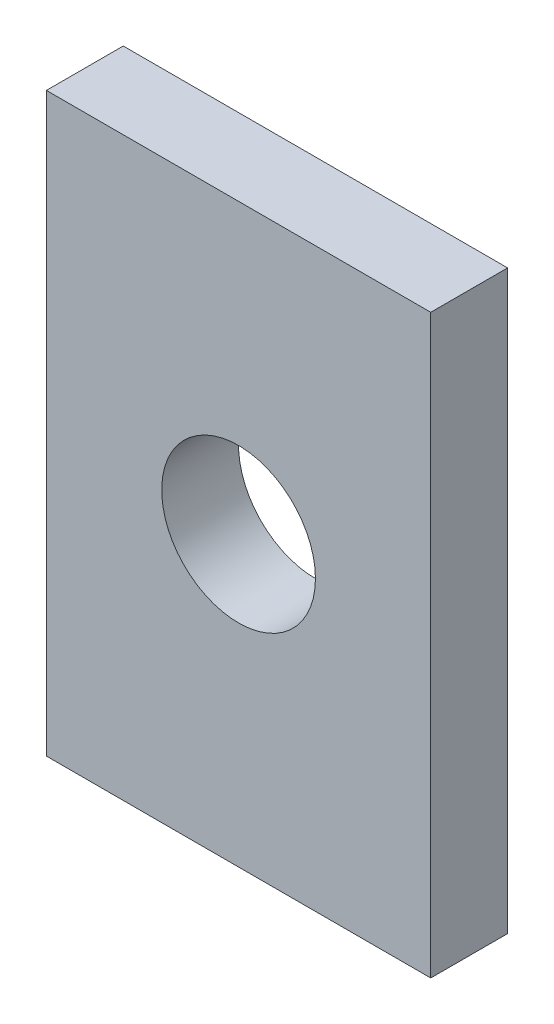
ISO-10303-21;
HEADER;
FILE_DESCRIPTION(('STEP AP214'),'2;1');
FILE_NAME('part.step','',(''),(''),'','','');
FILE_SCHEMA(('AUTOMOTIVE_DESIGN { 1 0 10303 214 1 1 1 1 }'));
ENDSEC;
DATA;
#1=APPLICATION_CONTEXT('core data for automotive mechanical design processes');
#2=APPLICATION_PROTOCOL_DEFINITION('international standard','automotive_design',2000,#1);
#3=PRODUCT_CONTEXT('',#1,'mechanical');
#4=PRODUCT('Part','Part','',(#3));
#5=PRODUCT_RELATED_PRODUCT_CATEGORY('part','',(#4));
#6=PRODUCT_DEFINITION_FORMATION('','',#4);
#7=PRODUCT_DEFINITION_CONTEXT('part definition',#1,'design');
#8=PRODUCT_DEFINITION('design','',#6,#7);
#9=PRODUCT_DEFINITION_SHAPE('','',#8);
#10=(LENGTH_UNIT() NAMED_UNIT(*) SI_UNIT(.MILLI.,.METRE.));
#11=(NAMED_UNIT(*) PLANE_ANGLE_UNIT() SI_UNIT($,.RADIAN.));
#12=(NAMED_UNIT(*) SI_UNIT($,.STERADIAN.) SOLID_ANGLE_UNIT());
#13=UNCERTAINTY_MEASURE_WITH_UNIT(LENGTH_MEASURE(1.E-05),#10,'distance_accuracy_value','');
#14=(GEOMETRIC_REPRESENTATION_CONTEXT(3) GLOBAL_UNCERTAINTY_ASSIGNED_CONTEXT((#13)) GLOBAL_UNIT_ASSIGNED_CONTEXT((#10,
#11,#12)) REPRESENTATION_CONTEXT('',''));
#15=CARTESIAN_POINT('',(0.,0.,0.));
#16=DIRECTION('',(0.,0.,1.));
#17=DIRECTION('',(1.,0.,0.));
#18=AXIS2_PLACEMENT_3D('',#15,#16,#17);
#19=CARTESIAN_POINT('',(0.,0.,8.));
#20=DIRECTION('',(0.,0.,-1.));
#21=DIRECTION('',(-1.,0.,0.));
#22=AXIS2_PLACEMENT_3D('',#19,#20,#21);
#23=PLANE('',#22);
#24=DIRECTION('',(0.,1.,0.));
#25=VECTOR('',#24,1.);
#26=CARTESIAN_POINT('',(20.,-30.,8.));
#27=LINE('',#26,#25);
#28=CARTESIAN_POINT('',(20.,-30.,8.));
#29=VERTEX_POINT('',#28);
#30=CARTESIAN_POINT('',(20.,30.,8.));
#31=VERTEX_POINT('',#30);
#32=EDGE_CURVE('E85',#29,#31,#27,.T.);
#33=ORIENTED_EDGE('',*,*,#32,.T.);
#34=DIRECTION('',(-1.,0.,0.));
#35=VECTOR('',#34,1.);
#36=CARTESIAN_POINT('',(-20.,30.,8.));
#37=LINE('',#36,#35);
#38=CARTESIAN_POINT('',(-20.,30.,8.));
#39=VERTEX_POINT('',#38);
#40=EDGE_CURVE('E80',#31,#39,#37,.T.);
#41=ORIENTED_EDGE('',*,*,#40,.T.);
#42=DIRECTION('',(0.,-1.,0.));
#43=VECTOR('',#42,1.);
#44=CARTESIAN_POINT('',(-20.,-30.,8.));
#45=LINE('',#44,#43);
#46=CARTESIAN_POINT('',(-20.,-30.,8.));
#47=VERTEX_POINT('',#46);
#48=EDGE_CURVE('E83',#39,#47,#45,.T.);
#49=ORIENTED_EDGE('',*,*,#48,.T.);
#50=DIRECTION('',(1.,0.,0.));
#51=VECTOR('',#50,1.);
#52=CARTESIAN_POINT('',(-20.,-30.,8.));
#53=LINE('',#52,#51);
#54=EDGE_CURVE('E50',#47,#29,#53,.T.);
#55=ORIENTED_EDGE('',*,*,#54,.T.);
#56=EDGE_LOOP('',(#33,#41,#49,#55));
#57=FACE_BOUND('',#56,.T.);
#58=CARTESIAN_POINT('',(0.,0.,8.));
#59=DIRECTION('',(0.,0.,1.));
#60=DIRECTION('',(1.,0.,0.));
#61=AXIS2_PLACEMENT_3D('',#58,#59,#60);
#62=CIRCLE('',#61,8.);
#63=CARTESIAN_POINT('',(8.00000000000001,0.,8.));
#64=VERTEX_POINT('',#63);
#65=EDGE_CURVE('E100',#64,#64,#62,.T.);
#66=ORIENTED_EDGE('',*,*,#65,.F.);
#67=EDGE_LOOP('',(#66));
#68=FACE_BOUND('',#67,.T.);
#69=ADVANCED_FACE('F33',(#57,#68),#23,.F.);
#70=CARTESIAN_POINT('',(0.,0.,0.));
#71=DIRECTION('',(0.,0.,-1.));
#72=DIRECTION('',(-1.,0.,0.));
#73=AXIS2_PLACEMENT_3D('',#70,#71,#72);
#74=PLANE('',#73);
#75=DIRECTION('',(0.,1.,0.));
#76=VECTOR('',#75,1.);
#77=CARTESIAN_POINT('',(20.,-30.,0.));
#78=LINE('',#77,#76);
#79=CARTESIAN_POINT('',(20.,-30.,0.));
#80=VERTEX_POINT('',#79);
#81=CARTESIAN_POINT('',(20.,30.,0.));
#82=VERTEX_POINT('',#81);
#83=EDGE_CURVE('E97',#80,#82,#78,.T.);
#84=ORIENTED_EDGE('',*,*,#83,.F.);
#85=DIRECTION('',(1.,0.,0.));
#86=VECTOR('',#85,1.);
#87=CARTESIAN_POINT('',(-20.,-30.,0.));
#88=LINE('',#87,#86);
#89=CARTESIAN_POINT('',(-20.,-30.,0.));
#90=VERTEX_POINT('',#89);
#91=EDGE_CURVE('E73',#90,#80,#88,.T.);
#92=ORIENTED_EDGE('',*,*,#91,.F.);
#93=DIRECTION('',(0.,-1.,0.));
#94=VECTOR('',#93,1.);
#95=CARTESIAN_POINT('',(-20.,-30.,0.));
#96=LINE('',#95,#94);
#97=CARTESIAN_POINT('',(-20.,30.,0.));
#98=VERTEX_POINT('',#97);
#99=EDGE_CURVE('E67',#98,#90,#96,.T.);
#100=ORIENTED_EDGE('',*,*,#99,.F.);
#101=DIRECTION('',(-1.,0.,0.));
#102=VECTOR('',#101,1.);
#103=CARTESIAN_POINT('',(-20.,30.,0.));
#104=LINE('',#103,#102);
#105=EDGE_CURVE('E89',#82,#98,#104,.T.);
#106=ORIENTED_EDGE('',*,*,#105,.F.);
#107=EDGE_LOOP('',(#84,#92,#100,#106));
#108=FACE_BOUND('',#107,.T.);
#109=CARTESIAN_POINT('',(0.,0.,0.));
#110=DIRECTION('',(0.,0.,1.));
#111=DIRECTION('',(1.,0.,0.));
#112=AXIS2_PLACEMENT_3D('',#109,#110,#111);
#113=CIRCLE('',#112,8.);
#114=CARTESIAN_POINT('',(8.00000000000001,0.,0.));
#115=VERTEX_POINT('',#114);
#116=EDGE_CURVE('E112',#115,#115,#113,.T.);
#117=ORIENTED_EDGE('',*,*,#116,.T.);
#118=EDGE_LOOP('',(#117));
#119=FACE_BOUND('',#118,.T.);
#120=ADVANCED_FACE('F108',(#108,#119),#74,.T.);
#121=CARTESIAN_POINT('',(20.,-30.,8.));
#122=DIRECTION('',(-1.,0.,0.));
#123=DIRECTION('',(0.,0.,1.));
#124=AXIS2_PLACEMENT_3D('',#121,#122,#123);
#125=PLANE('',#124);
#126=ORIENTED_EDGE('',*,*,#83,.T.);
#127=DIRECTION('',(0.,0.,-1.));
#128=VECTOR('',#127,1.);
#129=CARTESIAN_POINT('',(20.,30.,8.));
#130=LINE('',#129,#128);
#131=EDGE_CURVE('E11',#31,#82,#130,.T.);
#132=ORIENTED_EDGE('',*,*,#131,.F.);
#133=ORIENTED_EDGE('',*,*,#32,.F.);
#134=DIRECTION('',(0.,0.,-1.));
#135=VECTOR('',#134,1.);
#136=CARTESIAN_POINT('',(20.,-30.,8.));
#137=LINE('',#136,#135);
#138=EDGE_CURVE('E93',#29,#80,#137,.T.);
#139=ORIENTED_EDGE('',*,*,#138,.T.);
#140=EDGE_LOOP('',(#126,#132,#133,#139));
#141=FACE_BOUND('',#140,.T.);
#142=ADVANCED_FACE('F35',(#141),#125,.F.);
#143=CARTESIAN_POINT('',(-20.,30.,8.));
#144=DIRECTION('',(0.,-1.,0.));
#145=DIRECTION('',(0.,0.,-1.));
#146=AXIS2_PLACEMENT_3D('',#143,#144,#145);
#147=PLANE('',#146);
#148=ORIENTED_EDGE('',*,*,#105,.T.);
#149=DIRECTION('',(0.,0.,-1.));
#150=VECTOR('',#149,1.);
#151=CARTESIAN_POINT('',(-20.,30.,8.));
#152=LINE('',#151,#150);
#153=EDGE_CURVE('E42',#39,#98,#152,.T.);
#154=ORIENTED_EDGE('',*,*,#153,.F.);
#155=ORIENTED_EDGE('',*,*,#40,.F.);
#156=ORIENTED_EDGE('',*,*,#131,.T.);
#157=EDGE_LOOP('',(#148,#154,#155,#156));
#158=FACE_BOUND('',#157,.T.);
#159=ADVANCED_FACE('F88',(#158),#147,.F.);
#160=CARTESIAN_POINT('',(-20.,-30.,8.));
#161=DIRECTION('',(1.,0.,0.));
#162=DIRECTION('',(0.,0.,-1.));
#163=AXIS2_PLACEMENT_3D('',#160,#161,#162);
#164=PLANE('',#163);
#165=ORIENTED_EDGE('',*,*,#99,.T.);
#166=DIRECTION('',(0.,0.,-1.));
#167=VECTOR('',#166,1.);
#168=CARTESIAN_POINT('',(-20.,-30.,8.));
#169=LINE('',#168,#167);
#170=EDGE_CURVE('E90',#47,#90,#169,.T.);
#171=ORIENTED_EDGE('',*,*,#170,.F.);
#172=ORIENTED_EDGE('',*,*,#48,.F.);
#173=ORIENTED_EDGE('',*,*,#153,.T.);
#174=EDGE_LOOP('',(#165,#171,#172,#173));
#175=FACE_BOUND('',#174,.T.);
#176=ADVANCED_FACE('F91',(#175),#164,.F.);
#177=CARTESIAN_POINT('',(-20.,-30.,8.));
#178=DIRECTION('',(0.,1.,0.));
#179=DIRECTION('',(0.,0.,1.));
#180=AXIS2_PLACEMENT_3D('',#177,#178,#179);
#181=PLANE('',#180);
#182=ORIENTED_EDGE('',*,*,#91,.T.);
#183=ORIENTED_EDGE('',*,*,#138,.F.);
#184=ORIENTED_EDGE('',*,*,#54,.F.);
#185=ORIENTED_EDGE('',*,*,#170,.T.);
#186=EDGE_LOOP('',(#182,#183,#184,#185));
#187=FACE_BOUND('',#186,.T.);
#188=ADVANCED_FACE('F105',(#187),#181,.F.);
#189=CARTESIAN_POINT('',(0.,0.,8.));
#190=DIRECTION('',(0.,0.,-1.));
#191=DIRECTION('',(-1.,0.,0.));
#192=AXIS2_PLACEMENT_3D('',#189,#190,#191);
#193=CYLINDRICAL_SURFACE('',#192,8.);
#194=ORIENTED_EDGE('',*,*,#65,.T.);
#195=EDGE_LOOP('',(#194));
#196=FACE_BOUND('',#195,.T.);
#197=ORIENTED_EDGE('',*,*,#116,.F.);
#198=EDGE_LOOP('',(#197));
#199=FACE_BOUND('',#198,.T.);
#200=ADVANCED_FACE('F118',(#196,#199),#193,.F.);
#201=CLOSED_SHELL('',(#69,#120,#142,#159,#176,#188,#200));
#202=MANIFOLD_SOLID_BREP('B2',#201);
#203=ADVANCED_BREP_SHAPE_REPRESENTATION('',(#18,#202),#14);
#204=SHAPE_DEFINITION_REPRESENTATION(#9,#203);
ENDSEC;
END-ISO-10303-21;
